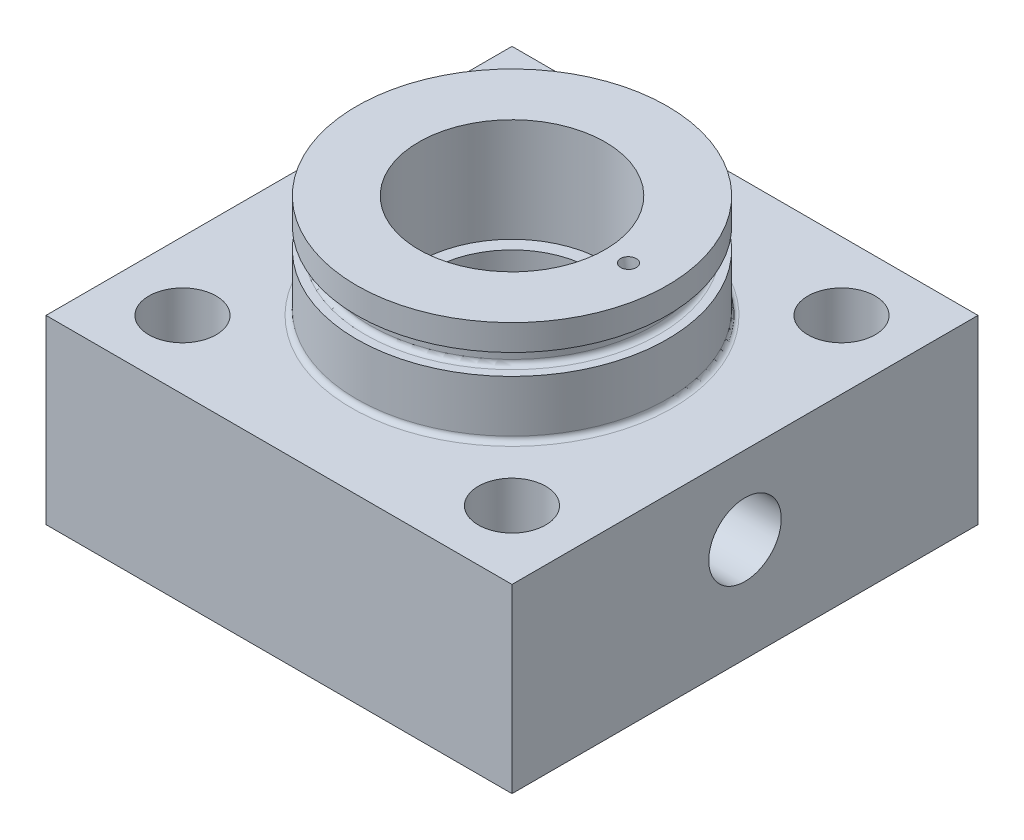
ISO-10303-21;
HEADER;
FILE_DESCRIPTION(('STEP AP214'),'2;1');
FILE_NAME('part.step','',(''),(''),'','','');
FILE_SCHEMA(('AUTOMOTIVE_DESIGN { 1 0 10303 214 1 1 1 1 }'));
ENDSEC;
DATA;
#1=APPLICATION_CONTEXT('core data for automotive mechanical design processes');
#2=APPLICATION_PROTOCOL_DEFINITION('international standard','automotive_design',2000,#1);
#3=PRODUCT_CONTEXT('',#1,'mechanical');
#4=PRODUCT('Part','Part','',(#3));
#5=PRODUCT_RELATED_PRODUCT_CATEGORY('part','',(#4));
#6=PRODUCT_DEFINITION_FORMATION('','',#4);
#7=PRODUCT_DEFINITION_CONTEXT('part definition',#1,'design');
#8=PRODUCT_DEFINITION('design','',#6,#7);
#9=PRODUCT_DEFINITION_SHAPE('','',#8);
#10=(LENGTH_UNIT() NAMED_UNIT(*) SI_UNIT(.MILLI.,.METRE.));
#11=(NAMED_UNIT(*) PLANE_ANGLE_UNIT() SI_UNIT($,.RADIAN.));
#12=(NAMED_UNIT(*) SI_UNIT($,.STERADIAN.) SOLID_ANGLE_UNIT());
#13=UNCERTAINTY_MEASURE_WITH_UNIT(LENGTH_MEASURE(1.E-05),#10,'distance_accuracy_value','');
#14=(GEOMETRIC_REPRESENTATION_CONTEXT(3) GLOBAL_UNCERTAINTY_ASSIGNED_CONTEXT((#13)) GLOBAL_UNIT_ASSIGNED_CONTEXT((#10,
#11,#12)) REPRESENTATION_CONTEXT('',''));
#15=CARTESIAN_POINT('',(0.,0.,0.));
#16=DIRECTION('',(0.,0.,1.));
#17=DIRECTION('',(1.,0.,0.));
#18=AXIS2_PLACEMENT_3D('',#15,#16,#17);
#19=CARTESIAN_POINT('',(0.,55.,0.));
#20=DIRECTION('',(0.,1.,0.));
#21=DIRECTION('',(0.,0.,1.));
#22=AXIS2_PLACEMENT_3D('',#19,#20,#21);
#23=PLANE('',#22);
#24=CARTESIAN_POINT('',(0.,55.,0.));
#25=DIRECTION('',(0.,-1.,0.));
#26=DIRECTION('',(0.,0.,-1.));
#27=AXIS2_PLACEMENT_3D('',#24,#25,#26);
#28=CIRCLE('',#27,18.);
#29=CARTESIAN_POINT('',(0.,55.,-18.));
#30=VERTEX_POINT('',#29);
#31=EDGE_CURVE('E150',#30,#30,#28,.T.);
#32=ORIENTED_EDGE('',*,*,#31,.T.);
#33=EDGE_LOOP('',(#32));
#34=FACE_BOUND('',#33,.T.);
#35=CARTESIAN_POINT('',(0.,55.,0.));
#36=DIRECTION('',(0.,1.,0.));
#37=DIRECTION('',(0.,0.,1.));
#38=AXIS2_PLACEMENT_3D('',#35,#36,#37);
#39=CIRCLE('',#38,30.);
#40=CARTESIAN_POINT('',(0.,55.,30.));
#41=VERTEX_POINT('',#40);
#42=EDGE_CURVE('E153',#41,#41,#39,.T.);
#43=ORIENTED_EDGE('',*,*,#42,.T.);
#44=EDGE_LOOP('',(#43));
#45=FACE_BOUND('',#44,.T.);
#46=CARTESIAN_POINT('',(22.5,55.,0.));
#47=DIRECTION('',(0.,1.,0.));
#48=DIRECTION('',(-1.,0.,0.));
#49=AXIS2_PLACEMENT_3D('',#46,#47,#48);
#50=ELLIPSE('',#49,1.52807504243282,1.5);
#51=CARTESIAN_POINT('',(20.9719249575672,55.,0.));
#52=VERTEX_POINT('',#51);
#53=EDGE_CURVE('E99',#52,#52,#50,.T.);
#54=ORIENTED_EDGE('',*,*,#53,.F.);
#55=EDGE_LOOP('',(#54));
#56=FACE_BOUND('',#55,.T.);
#57=ADVANCED_FACE('F38',(#34,#45,#56),#23,.T.);
#58=CARTESIAN_POINT('',(27.,20.,0.));
#59=DIRECTION('',(1.,0.,0.));
#60=DIRECTION('',(0.,0.,-1.));
#61=AXIS2_PLACEMENT_3D('',#58,#59,#60);
#62=CONICAL_SURFACE('',#61,7.,1.02974425867665);
#63=CARTESIAN_POINT('',(22.7939756668071,20.,0.));
#64=VERTEX_POINT('',#63);
#65=VERTEX_LOOP('',#64);
#66=FACE_BOUND('',#65,.T.);
#67=CARTESIAN_POINT('',(27.0002000000009,26.9025560211562,1.16592472662914));
#68=CARTESIAN_POINT('',(26.9557471986683,26.8351827867763,1.12020981943226));
#69=CARTESIAN_POINT('',(26.9123093250318,26.7703503300823,1.06886121542777));
#70=CARTESIAN_POINT('',(26.8293614449284,26.6480668091781,0.95421329721106));
#71=CARTESIAN_POINT('',(26.7898892242114,26.5906854615497,0.890813130714368));
#72=CARTESIAN_POINT('',(26.7254706650835,26.4981487202898,0.767215922519848));
#73=CARTESIAN_POINT('',(26.6992309276878,26.4608723352743,0.709309347198773));
#74=CARTESIAN_POINT('',(26.6523623589619,26.3948114018753,0.586945834746067));
#75=CARTESIAN_POINT('',(26.6317164053611,26.3660009164001,0.522509735648986));
#76=CARTESIAN_POINT('',(26.5972407465655,26.3181573434041,0.387626677030079));
#77=CARTESIAN_POINT('',(26.5834742116664,26.2992148034648,0.317130736717303));
#78=CARTESIAN_POINT('',(26.564275254162,26.2728568313713,0.172868456593609));
#79=CARTESIAN_POINT('',(26.5588418265405,26.2654400091542,0.0991025122664565));
#80=CARTESIAN_POINT('',(26.5569686559182,26.262880919729,-0.0390022692295941));
#81=CARTESIAN_POINT('',(26.5594400204153,26.2662525575678,-0.103304955583692));
#82=CARTESIAN_POINT('',(26.5708619743497,26.2818957014114,-0.230200999365168));
#83=CARTESIAN_POINT('',(26.5798106114341,26.2941645256649,-0.292794865959872));
#84=CARTESIAN_POINT('',(26.6032954196086,26.3265593320812,-0.413294823835385));
#85=CARTESIAN_POINT('',(26.6177082363583,26.3465119974908,-0.471272461180886));
#86=CARTESIAN_POINT('',(26.6512750360872,26.3933335161948,-0.5828808403607));
#87=CARTESIAN_POINT('',(26.6704313483764,26.4202057676356,-0.636509429352935));
#88=CARTESIAN_POINT('',(26.7205992737893,26.4911969769087,-0.758239344651641));
#89=CARTESIAN_POINT('',(26.7533467793441,26.5379858586705,-0.824067812989315));
#90=CARTESIAN_POINT('',(26.8239048094191,26.6401520509939,-0.945590901469656));
#91=CARTESIAN_POINT('',(26.8617236513894,26.6955434946542,-1.00126851159667));
#92=CARTESIAN_POINT('',(26.917210167002,26.7778888972262,-1.07260550826475));
#93=CARTESIAN_POINT('',(26.9335445389282,26.802252091771,-1.0924335836804));
#94=CARTESIAN_POINT('',(26.9665919876018,26.8517953974833,-1.13040006163989));
#95=CARTESIAN_POINT('',(26.9833030318249,26.8769713439381,-1.14854565923984));
#96=CARTESIAN_POINT('',(27.0002000000005,26.9025560211554,-1.1659247266304));
#97=B_SPLINE_CURVE_WITH_KNOTS('',3,(#67,#68,#69,#70,#71,#72,#73,#74,#75,#76,#77,#78,#79,#80,#81,
#82,#83,#84,#85,#86,#87,#88,#89,#90,#91,#92,#93,#94,#95,#96),.UNSPECIFIED.,.F.,.F.,(4,2,2,2,2,2,
2,2,2,2,2,2,2,2,4),(0.,0.278795202966231,0.560035286614454,0.780245184551265,0.99977321487787,
1.22128163148936,1.44276333093355,1.63511494120735,1.82740859777992,2.01559738073721,
2.20387875835251,2.46391097070981,2.72437499806625,2.83055287480321,2.93625343960105),.UNSPECIFIED.);
#98=CARTESIAN_POINT('',(27.,26.9022531981226,1.16571900087752));
#99=VERTEX_POINT('',#98);
#100=CARTESIAN_POINT('',(27.,26.9022531981226,-1.16571900087752));
#101=VERTEX_POINT('',#100);
#102=EDGE_CURVE('E57',#99,#101,#97,.T.);
#103=ORIENTED_EDGE('',*,*,#102,.F.);
#104=CARTESIAN_POINT('',(27.,20.,0.));
#105=DIRECTION('',(1.,0.,0.));
#106=DIRECTION('',(0.,0.,-1.));
#107=AXIS2_PLACEMENT_3D('',#104,#105,#106);
#108=CIRCLE('',#107,7.);
#109=EDGE_CURVE('E97',#99,#101,#108,.T.);
#110=ORIENTED_EDGE('',*,*,#109,.T.);
#111=EDGE_LOOP('',(#103,#110));
#112=FACE_BOUND('',#111,.T.);
#113=ADVANCED_FACE('F96',(#66,#112),#62,.F.);
#114=CARTESIAN_POINT('',(45.,20.,0.));
#115=DIRECTION('',(1.,0.,0.));
#116=DIRECTION('',(0.,0.,-1.));
#117=AXIS2_PLACEMENT_3D('',#114,#115,#116);
#118=CYLINDRICAL_SURFACE('',#117,6.99999999999999);
#119=CARTESIAN_POINT('',(45.,20.,0.));
#120=DIRECTION('',(1.,0.,0.));
#121=DIRECTION('',(0.,0.,-1.));
#122=AXIS2_PLACEMENT_3D('',#119,#120,#121);
#123=CIRCLE('',#122,6.99999999999999);
#124=CARTESIAN_POINT('',(45.,20.,-6.99999999999998));
#125=VERTEX_POINT('',#124);
#126=EDGE_CURVE('E98',#125,#125,#123,.T.);
#127=ORIENTED_EDGE('',*,*,#126,.T.);
#128=EDGE_LOOP('',(#127));
#129=FACE_BOUND('',#128,.T.);
#130=CARTESIAN_POINT('',(27.,26.9022531981226,-1.16571900087752));
#131=CARTESIAN_POINT('',(27.0703399257818,26.8930190998978,-1.22025468295606));
#132=CARTESIAN_POINT('',(27.1453503336944,26.8841736608435,-1.26881501498369));
#133=CARTESIAN_POINT('',(27.3025893545098,26.8681487627433,-1.35294548860597));
#134=CARTESIAN_POINT('',(27.3848248078652,26.8609709064573,-1.38850315165746));
#135=CARTESIAN_POINT('',(27.5543198117525,26.8491859619893,-1.44550436690424));
#136=CARTESIAN_POINT('',(27.6415835571262,26.8445810555661,-1.46693594349939));
#137=CARTESIAN_POINT('',(27.8185402212261,26.8385586985497,-1.49476735894631));
#138=CARTESIAN_POINT('',(27.9082312942767,26.8371388913859,-1.50117831131656));
#139=CARTESIAN_POINT('',(28.0852526229535,26.837726588571,-1.49849737617922));
#140=CARTESIAN_POINT('',(28.1725884184588,26.8396536046781,-1.489769569409));
#141=CARTESIAN_POINT('',(28.344359048974,26.8466096902637,-1.45746592311796));
#142=CARTESIAN_POINT('',(28.4287939494422,26.8516386896977,-1.43389041886605));
#143=CARTESIAN_POINT('',(28.588859335821,26.8639672225966,-1.37362748579696));
#144=CARTESIAN_POINT('',(28.6647053688172,26.8711698275247,-1.33749137091391));
#145=CARTESIAN_POINT('',(28.8090399581684,26.887085240569,-1.25295598387026));
#146=CARTESIAN_POINT('',(28.8775293623143,26.8957978743638,-1.20455812693838));
#147=CARTESIAN_POINT('',(29.0045557975033,26.9136475120347,-1.09744505516076));
#148=CARTESIAN_POINT('',(29.0631913473845,26.9227789870094,-1.03884560297038));
#149=CARTESIAN_POINT('',(29.1698670366684,26.9405459238536,-0.912621132242576));
#150=CARTESIAN_POINT('',(29.2179065958447,26.9491813585414,-0.844995619771942));
#151=CARTESIAN_POINT('',(29.3025468718788,26.9650870829628,-0.701980139445608));
#152=CARTESIAN_POINT('',(29.3390446665384,26.9723448709412,-0.62652786386578));
#153=CARTESIAN_POINT('',(29.3991188338988,26.9846100583683,-0.470472182612644));
#154=CARTESIAN_POINT('',(29.4226949233999,26.9896174084947,-0.389868664084903));
#155=CARTESIAN_POINT('',(29.4564387267677,26.9968607077887,-0.225298045526707));
#156=CARTESIAN_POINT('',(29.4665289838591,26.999080642883,-0.141314344903382));
#157=CARTESIAN_POINT('',(29.4727968846034,27.0004542395642,0.0271956560167797));
#158=CARTESIAN_POINT('',(29.4689744339871,26.9996078803748,0.111721959986292));
#159=CARTESIAN_POINT('',(29.4475116055433,26.9949408829833,0.278924824638343));
#160=CARTESIAN_POINT('',(29.429870074133,26.9911199964753,0.361601230303261));
#161=CARTESIAN_POINT('',(29.3812078031611,26.9809205213274,0.52275377174951));
#162=CARTESIAN_POINT('',(29.3501868160755,26.9745418853687,0.601229829792959));
#163=CARTESIAN_POINT('',(29.2755340980976,26.9599255102752,0.751773645133417));
#164=CARTESIAN_POINT('',(29.2318991569969,26.9516872980016,0.823839765010035));
#165=CARTESIAN_POINT('',(29.1331353689054,26.934267992921,0.959484563681352));
#166=CARTESIAN_POINT('',(29.0780067789313,26.9250869212,1.02306343221279));
#167=CARTESIAN_POINT('',(28.9579251685022,26.9068494134804,1.13969804673486));
#168=CARTESIAN_POINT('',(28.8930077479804,26.8977926505639,1.1927903766027));
#169=CARTESIAN_POINT('',(28.7549924346718,26.8807987637808,1.28721338282879));
#170=CARTESIAN_POINT('',(28.6818953363111,26.8728615313523,1.32854520001184));
#171=CARTESIAN_POINT('',(28.5303433110149,26.8590732346296,1.39798511577011));
#172=CARTESIAN_POINT('',(28.4519462639682,26.8532029581542,1.42621581594965));
#173=CARTESIAN_POINT('',(28.2914398338856,26.8440791641152,1.46937781803568));
#174=CARTESIAN_POINT('',(28.2093307116833,26.8408254629957,1.4843100528541));
#175=CARTESIAN_POINT('',(28.0435284973748,26.8372456521932,1.50071433111481));
#176=CARTESIAN_POINT('',(27.9598320575912,26.8369266347656,1.50215376664338));
#177=CARTESIAN_POINT('',(27.7932881708397,26.8392091285329,1.49172508560607));
#178=CARTESIAN_POINT('',(27.7104411534262,26.8418120503089,1.47985054165115));
#179=CARTESIAN_POINT('',(27.5451280714467,26.8497306643927,1.44276102290741));
#180=CARTESIAN_POINT('',(27.4627604316339,26.855131124322,1.41712822891844));
#181=CARTESIAN_POINT('',(27.3033832793302,26.8680517011054,1.35311601803852));
#182=CARTESIAN_POINT('',(27.2263676066027,26.8755693289251,1.31475155965436));
#183=CARTESIAN_POINT('',(27.1265052298055,26.8866760376606,1.25457375346957));
#184=CARTESIAN_POINT('',(27.1004490846446,26.8897113215701,1.23781799035897));
#185=CARTESIAN_POINT('',(27.0494143227519,26.8959017196965,1.20285263049424));
#186=CARTESIAN_POINT('',(27.0244338848618,26.8990566128922,1.18464565270883));
#187=CARTESIAN_POINT('',(27.,26.9022531981226,1.16571900087752));
#188=B_SPLINE_CURVE_WITH_KNOTS('',3,(#130,#131,#132,#133,#134,#135,#136,#137,#138,#139,#140,
#141,#142,#143,#144,#145,#146,#147,#148,#149,#150,#151,#152,#153,#154,#155,#156,#157,#158,#159,
#160,#161,#162,#163,#164,#165,#166,#167,#168,#169,#170,#171,#172,#173,#174,#175,#176,#177,#178,
#179,#180,#181,#182,#183,#184,#185,#186,#187),.UNSPECIFIED.,.F.,.F.,(4,2,2,2,2,2,2,2,2,2,2,2,2,
2,2,2,2,2,2,2,2,2,2,2,2,2,2,2,4),(0.,0.268127180453118,0.536511008971517,0.805122072229803,
1.07353433163254,1.33558055117146,1.5976208537795,1.8493699214137,2.10108994583936,
2.35012042739379,2.59916454223781,2.85037063660583,3.10158223633364,3.35423057347462,
3.60688062250259,3.85955176438251,4.11222758095465,4.36496775935842,4.61770228668273,
4.86953890267855,5.12135108100841,5.37075673857607,5.62014489849715,5.8701355973709,
6.12024703246488,6.37842337933574,6.63629746092069,6.72963856216666,6.82281486983012),.UNSPECIFIED.);
#189=EDGE_CURVE('E11',#101,#99,#188,.T.);
#190=ORIENTED_EDGE('',*,*,#189,.F.);
#191=ORIENTED_EDGE('',*,*,#109,.F.);
#192=EDGE_LOOP('',(#190,#191));
#193=FACE_BOUND('',#192,.T.);
#194=ADVANCED_FACE('F101',(#129,#193),#118,.F.);
#195=CARTESIAN_POINT('',(-45.,0.,-45.));
#196=DIRECTION('',(0.,-1.,0.));
#197=DIRECTION('',(0.,0.,-1.));
#198=AXIS2_PLACEMENT_3D('',#195,#196,#197);
#199=PLANE('',#198);
#200=CARTESIAN_POINT('',(-31.8198051533946,0.,31.8198051533946));
#201=DIRECTION('',(0.,-1.,0.));
#202=DIRECTION('',(0.,0.,1.));
#203=AXIS2_PLACEMENT_3D('',#200,#201,#202);
#204=CIRCLE('',#203,6.5);
#205=CARTESIAN_POINT('',(-31.8198051533946,0.,38.3198051533946));
#206=VERTEX_POINT('',#205);
#207=EDGE_CURVE('E102',#206,#206,#204,.T.);
#208=ORIENTED_EDGE('',*,*,#207,.F.);
#209=EDGE_LOOP('',(#208));
#210=FACE_BOUND('',#209,.T.);
#211=CARTESIAN_POINT('',(31.8198051533946,0.,31.8198051533946));
#212=DIRECTION('',(0.,1.,0.));
#213=DIRECTION('',(0.,0.,1.));
#214=AXIS2_PLACEMENT_3D('',#211,#212,#213);
#215=CIRCLE('',#214,6.5);
#216=CARTESIAN_POINT('',(31.8198051533946,0.,38.3198051533946));
#217=VERTEX_POINT('',#216);
#218=EDGE_CURVE('E114',#217,#217,#215,.T.);
#219=ORIENTED_EDGE('',*,*,#218,.T.);
#220=EDGE_LOOP('',(#219));
#221=FACE_BOUND('',#220,.T.);
#222=CARTESIAN_POINT('',(31.8198051533946,0.,-31.8198051533946));
#223=DIRECTION('',(0.,-1.,0.));
#224=DIRECTION('',(0.,0.,-1.));
#225=AXIS2_PLACEMENT_3D('',#222,#223,#224);
#226=CIRCLE('',#225,6.5);
#227=CARTESIAN_POINT('',(31.8198051533946,0.,-38.3198051533946));
#228=VERTEX_POINT('',#227);
#229=EDGE_CURVE('E118',#228,#228,#226,.T.);
#230=ORIENTED_EDGE('',*,*,#229,.F.);
#231=EDGE_LOOP('',(#230));
#232=FACE_BOUND('',#231,.T.);
#233=DIRECTION('',(0.,0.,1.));
#234=VECTOR('',#233,1.);
#235=CARTESIAN_POINT('',(-45.,0.,45.));
#236=LINE('',#235,#234);
#237=CARTESIAN_POINT('',(-45.,0.,-45.));
#238=VERTEX_POINT('',#237);
#239=CARTESIAN_POINT('',(-45.,0.,45.));
#240=VERTEX_POINT('',#239);
#241=EDGE_CURVE('E156',#238,#240,#236,.T.);
#242=ORIENTED_EDGE('',*,*,#241,.F.);
#243=DIRECTION('',(-1.,0.,0.));
#244=VECTOR('',#243,1.);
#245=CARTESIAN_POINT('',(-45.,0.,-45.));
#246=LINE('',#245,#244);
#247=CARTESIAN_POINT('',(45.,0.,-45.));
#248=VERTEX_POINT('',#247);
#249=EDGE_CURVE('E163',#248,#238,#246,.T.);
#250=ORIENTED_EDGE('',*,*,#249,.F.);
#251=DIRECTION('',(0.,0.,-1.));
#252=VECTOR('',#251,1.);
#253=CARTESIAN_POINT('',(45.,0.,45.));
#254=LINE('',#253,#252);
#255=CARTESIAN_POINT('',(45.,0.,45.));
#256=VERTEX_POINT('',#255);
#257=EDGE_CURVE('E161',#256,#248,#254,.T.);
#258=ORIENTED_EDGE('',*,*,#257,.F.);
#259=DIRECTION('',(1.,0.,0.));
#260=VECTOR('',#259,1.);
#261=CARTESIAN_POINT('',(-45.,0.,45.));
#262=LINE('',#261,#260);
#263=EDGE_CURVE('E159',#240,#256,#262,.T.);
#264=ORIENTED_EDGE('',*,*,#263,.F.);
#265=EDGE_LOOP('',(#242,#250,#258,#264));
#266=FACE_BOUND('',#265,.T.);
#267=CARTESIAN_POINT('',(0.,0.,0.));
#268=DIRECTION('',(0.,-1.,0.));
#269=DIRECTION('',(0.,0.,-1.));
#270=AXIS2_PLACEMENT_3D('',#267,#268,#269);
#271=CIRCLE('',#270,23.);
#272=CARTESIAN_POINT('',(0.,0.,-23.));
#273=VERTEX_POINT('',#272);
#274=EDGE_CURVE('E122',#273,#273,#271,.T.);
#275=ORIENTED_EDGE('',*,*,#274,.F.);
#276=EDGE_LOOP('',(#275));
#277=FACE_BOUND('',#276,.T.);
#278=CARTESIAN_POINT('',(-31.8198051533946,0.,-31.8198051533946));
#279=DIRECTION('',(0.,1.,0.));
#280=DIRECTION('',(0.,0.,-1.));
#281=AXIS2_PLACEMENT_3D('',#278,#279,#280);
#282=CIRCLE('',#281,6.5);
#283=CARTESIAN_POINT('',(-31.8198051533946,0.,-38.3198051533946));
#284=VERTEX_POINT('',#283);
#285=EDGE_CURVE('E110',#284,#284,#282,.T.);
#286=ORIENTED_EDGE('',*,*,#285,.T.);
#287=EDGE_LOOP('',(#286));
#288=FACE_BOUND('',#287,.T.);
#289=ADVANCED_FACE('F250',(#210,#221,#232,#266,#277,#288),#199,.T.);
#290=CARTESIAN_POINT('',(-45.,35.,-45.));
#291=DIRECTION('',(0.,-1.,0.));
#292=DIRECTION('',(0.,0.,-1.));
#293=AXIS2_PLACEMENT_3D('',#290,#291,#292);
#294=PLANE('',#293);
#295=CARTESIAN_POINT('',(0.,35.,0.));
#296=DIRECTION('',(0.,-1.,0.));
#297=DIRECTION('',(0.,0.,-1.));
#298=AXIS2_PLACEMENT_3D('',#295,#296,#297);
#299=CIRCLE('',#298,31.);
#300=CARTESIAN_POINT('',(0.,35.,-31.));
#301=VERTEX_POINT('',#300);
#302=EDGE_CURVE('E200',#301,#301,#299,.T.);
#303=ORIENTED_EDGE('',*,*,#302,.T.);
#304=EDGE_LOOP('',(#303));
#305=FACE_BOUND('',#304,.T.);
#306=CARTESIAN_POINT('',(-31.8198051533946,35.,31.8198051533946));
#307=DIRECTION('',(0.,-1.,0.));
#308=DIRECTION('',(0.,0.,-1.));
#309=AXIS2_PLACEMENT_3D('',#306,#307,#308);
#310=CIRCLE('',#309,6.5);
#311=CARTESIAN_POINT('',(-31.8198051533946,35.,25.3198051533946));
#312=VERTEX_POINT('',#311);
#313=EDGE_CURVE('E105',#312,#312,#310,.T.);
#314=ORIENTED_EDGE('',*,*,#313,.T.);
#315=EDGE_LOOP('',(#314));
#316=FACE_BOUND('',#315,.T.);
#317=CARTESIAN_POINT('',(31.8198051533946,35.,31.8198051533946));
#318=DIRECTION('',(0.,-1.,0.));
#319=DIRECTION('',(0.,0.,-1.));
#320=AXIS2_PLACEMENT_3D('',#317,#318,#319);
#321=CIRCLE('',#320,6.5);
#322=CARTESIAN_POINT('',(31.8198051533946,35.,25.3198051533946));
#323=VERTEX_POINT('',#322);
#324=EDGE_CURVE('E117',#323,#323,#321,.F.);
#325=ORIENTED_EDGE('',*,*,#324,.F.);
#326=EDGE_LOOP('',(#325));
#327=FACE_BOUND('',#326,.T.);
#328=CARTESIAN_POINT('',(31.8198051533946,35.,-31.8198051533946));
#329=DIRECTION('',(0.,-1.,0.));
#330=DIRECTION('',(0.,0.,-1.));
#331=AXIS2_PLACEMENT_3D('',#328,#329,#330);
#332=CIRCLE('',#331,6.5);
#333=CARTESIAN_POINT('',(31.8198051533946,35.,-38.3198051533946));
#334=VERTEX_POINT('',#333);
#335=EDGE_CURVE('E121',#334,#334,#332,.T.);
#336=ORIENTED_EDGE('',*,*,#335,.T.);
#337=EDGE_LOOP('',(#336));
#338=FACE_BOUND('',#337,.T.);
#339=DIRECTION('',(0.,0.,1.));
#340=VECTOR('',#339,1.);
#341=CARTESIAN_POINT('',(-45.,35.,45.));
#342=LINE('',#341,#340);
#343=CARTESIAN_POINT('',(-45.,35.,-45.));
#344=VERTEX_POINT('',#343);
#345=CARTESIAN_POINT('',(-45.,35.,45.));
#346=VERTEX_POINT('',#345);
#347=EDGE_CURVE('E165',#344,#346,#342,.T.);
#348=ORIENTED_EDGE('',*,*,#347,.T.);
#349=DIRECTION('',(1.,0.,0.));
#350=VECTOR('',#349,1.);
#351=CARTESIAN_POINT('',(-45.,35.,45.));
#352=LINE('',#351,#350);
#353=CARTESIAN_POINT('',(45.,35.,45.));
#354=VERTEX_POINT('',#353);
#355=EDGE_CURVE('E167',#346,#354,#352,.T.);
#356=ORIENTED_EDGE('',*,*,#355,.T.);
#357=DIRECTION('',(0.,0.,-1.));
#358=VECTOR('',#357,1.);
#359=CARTESIAN_POINT('',(45.,35.,45.));
#360=LINE('',#359,#358);
#361=CARTESIAN_POINT('',(45.,35.,-45.));
#362=VERTEX_POINT('',#361);
#363=EDGE_CURVE('E169',#354,#362,#360,.T.);
#364=ORIENTED_EDGE('',*,*,#363,.T.);
#365=DIRECTION('',(-1.,0.,0.));
#366=VECTOR('',#365,1.);
#367=CARTESIAN_POINT('',(-45.,35.,-45.));
#368=LINE('',#367,#366);
#369=EDGE_CURVE('E65',#362,#344,#368,.T.);
#370=ORIENTED_EDGE('',*,*,#369,.T.);
#371=EDGE_LOOP('',(#348,#356,#364,#370));
#372=FACE_BOUND('',#371,.T.);
#373=CARTESIAN_POINT('',(-31.8198051533946,35.,-31.8198051533946));
#374=DIRECTION('',(0.,-1.,0.));
#375=DIRECTION('',(0.,0.,-1.));
#376=AXIS2_PLACEMENT_3D('',#373,#374,#375);
#377=CIRCLE('',#376,6.5);
#378=CARTESIAN_POINT('',(-31.8198051533946,35.,-38.3198051533946));
#379=VERTEX_POINT('',#378);
#380=EDGE_CURVE('E113',#379,#379,#377,.F.);
#381=ORIENTED_EDGE('',*,*,#380,.F.);
#382=EDGE_LOOP('',(#381));
#383=FACE_BOUND('',#382,.T.);
#384=ADVANCED_FACE('F248',(#305,#316,#327,#338,#372,#383),#294,.F.);
#385=CARTESIAN_POINT('',(0.,55.,0.));
#386=DIRECTION('',(0.,-1.,0.));
#387=DIRECTION('',(0.,0.,-1.));
#388=AXIS2_PLACEMENT_3D('',#385,#386,#387);
#389=CYLINDRICAL_SURFACE('',#388,30.);
#390=CARTESIAN_POINT('',(0.,36.,0.));
#391=DIRECTION('',(0.,-1.,0.));
#392=DIRECTION('',(0.,0.,-1.));
#393=AXIS2_PLACEMENT_3D('',#390,#391,#392);
#394=CIRCLE('',#393,30.);
#395=CARTESIAN_POINT('',(0.,36.,-30.));
#396=VERTEX_POINT('',#395);
#397=EDGE_CURVE('E184',#396,#396,#394,.F.);
#398=ORIENTED_EDGE('',*,*,#397,.T.);
#399=EDGE_LOOP('',(#398));
#400=FACE_BOUND('',#399,.T.);
#401=CARTESIAN_POINT('',(0.,46.,0.));
#402=DIRECTION('',(0.,1.,0.));
#403=DIRECTION('',(0.,0.,1.));
#404=AXIS2_PLACEMENT_3D('',#401,#402,#403);
#405=CIRCLE('',#404,30.);
#406=CARTESIAN_POINT('',(0.,46.,30.));
#407=VERTEX_POINT('',#406);
#408=EDGE_CURVE('E126',#407,#407,#405,.T.);
#409=ORIENTED_EDGE('',*,*,#408,.F.);
#410=EDGE_LOOP('',(#409));
#411=FACE_BOUND('',#410,.T.);
#412=ADVANCED_FACE('F244',(#400,#411),#389,.T.);
#413=ORIENTED_EDGE('',*,*,#42,.F.);
#414=EDGE_LOOP('',(#413));
#415=FACE_BOUND('',#414,.T.);
#416=CARTESIAN_POINT('',(0.,50.,0.));
#417=DIRECTION('',(0.,-1.,0.));
#418=DIRECTION('',(0.,0.,-1.));
#419=AXIS2_PLACEMENT_3D('',#416,#417,#418);
#420=CIRCLE('',#419,30.);
#421=CARTESIAN_POINT('',(0.,50.,-30.));
#422=VERTEX_POINT('',#421);
#423=EDGE_CURVE('E185',#422,#422,#420,.T.);
#424=ORIENTED_EDGE('',*,*,#423,.F.);
#425=EDGE_LOOP('',(#424));
#426=FACE_BOUND('',#425,.T.);
#427=ADVANCED_FACE('F247',(#415,#426),#389,.T.);
#428=CARTESIAN_POINT('',(-45.,35.,45.));
#429=DIRECTION('',(1.,0.,0.));
#430=DIRECTION('',(0.,0.,-1.));
#431=AXIS2_PLACEMENT_3D('',#428,#429,#430);
#432=PLANE('',#431);
#433=ORIENTED_EDGE('',*,*,#241,.T.);
#434=DIRECTION('',(0.,-1.,0.));
#435=VECTOR('',#434,1.);
#436=CARTESIAN_POINT('',(-45.,35.,45.));
#437=LINE('',#436,#435);
#438=EDGE_CURVE('E181',#346,#240,#437,.T.);
#439=ORIENTED_EDGE('',*,*,#438,.F.);
#440=ORIENTED_EDGE('',*,*,#347,.F.);
#441=DIRECTION('',(0.,-1.,0.));
#442=VECTOR('',#441,1.);
#443=CARTESIAN_POINT('',(-45.,35.,-45.));
#444=LINE('',#443,#442);
#445=EDGE_CURVE('E172',#344,#238,#444,.T.);
#446=ORIENTED_EDGE('',*,*,#445,.T.);
#447=EDGE_LOOP('',(#433,#439,#440,#446));
#448=FACE_BOUND('',#447,.T.);
#449=ADVANCED_FACE('F40',(#448),#432,.F.);
#450=CARTESIAN_POINT('',(-45.,35.,45.));
#451=DIRECTION('',(0.,0.,-1.));
#452=DIRECTION('',(-1.,0.,0.));
#453=AXIS2_PLACEMENT_3D('',#450,#451,#452);
#454=PLANE('',#453);
#455=ORIENTED_EDGE('',*,*,#263,.T.);
#456=DIRECTION('',(0.,-1.,0.));
#457=VECTOR('',#456,1.);
#458=CARTESIAN_POINT('',(45.,35.,45.));
#459=LINE('',#458,#457);
#460=EDGE_CURVE('E178',#354,#256,#459,.T.);
#461=ORIENTED_EDGE('',*,*,#460,.F.);
#462=ORIENTED_EDGE('',*,*,#355,.F.);
#463=ORIENTED_EDGE('',*,*,#438,.T.);
#464=EDGE_LOOP('',(#455,#461,#462,#463));
#465=FACE_BOUND('',#464,.T.);
#466=ADVANCED_FACE('F263',(#465),#454,.F.);
#467=CARTESIAN_POINT('',(45.,35.,45.));
#468=DIRECTION('',(-1.,0.,0.));
#469=DIRECTION('',(0.,0.,1.));
#470=AXIS2_PLACEMENT_3D('',#467,#468,#469);
#471=PLANE('',#470);
#472=ORIENTED_EDGE('',*,*,#126,.F.);
#473=EDGE_LOOP('',(#472));
#474=FACE_BOUND('',#473,.T.);
#475=ORIENTED_EDGE('',*,*,#257,.T.);
#476=DIRECTION('',(0.,-1.,0.));
#477=VECTOR('',#476,1.);
#478=CARTESIAN_POINT('',(45.,35.,-45.));
#479=LINE('',#478,#477);
#480=EDGE_CURVE('E175',#362,#248,#479,.T.);
#481=ORIENTED_EDGE('',*,*,#480,.F.);
#482=ORIENTED_EDGE('',*,*,#363,.F.);
#483=ORIENTED_EDGE('',*,*,#460,.T.);
#484=EDGE_LOOP('',(#475,#481,#482,#483));
#485=FACE_BOUND('',#484,.T.);
#486=ADVANCED_FACE('F260',(#474,#485),#471,.F.);
#487=CARTESIAN_POINT('',(-45.,35.,-45.));
#488=DIRECTION('',(0.,0.,1.));
#489=DIRECTION('',(1.,0.,0.));
#490=AXIS2_PLACEMENT_3D('',#487,#488,#489);
#491=PLANE('',#490);
#492=ORIENTED_EDGE('',*,*,#249,.T.);
#493=ORIENTED_EDGE('',*,*,#445,.F.);
#494=ORIENTED_EDGE('',*,*,#369,.F.);
#495=ORIENTED_EDGE('',*,*,#480,.T.);
#496=EDGE_LOOP('',(#492,#493,#494,#495));
#497=FACE_BOUND('',#496,.T.);
#498=ADVANCED_FACE('F257',(#497),#491,.F.);
#499=CARTESIAN_POINT('',(0.,0.,0.));
#500=DIRECTION('',(0.,-1.,0.));
#501=DIRECTION('',(0.,0.,-1.));
#502=AXIS2_PLACEMENT_3D('',#499,#500,#501);
#503=CYLINDRICAL_SURFACE('',#502,18.);
#504=CARTESIAN_POINT('',(0.,35.,0.));
#505=DIRECTION('',(0.,-1.,0.));
#506=DIRECTION('',(0.,0.,-1.));
#507=AXIS2_PLACEMENT_3D('',#504,#505,#506);
#508=CIRCLE('',#507,18.);
#509=CARTESIAN_POINT('',(0.,35.,-18.));
#510=VERTEX_POINT('',#509);
#511=EDGE_CURVE('E147',#510,#510,#508,.T.);
#512=ORIENTED_EDGE('',*,*,#511,.T.);
#513=EDGE_LOOP('',(#512));
#514=FACE_BOUND('',#513,.T.);
#515=ORIENTED_EDGE('',*,*,#31,.F.);
#516=EDGE_LOOP('',(#515));
#517=FACE_BOUND('',#516,.T.);
#518=ADVANCED_FACE('F242',(#514,#517),#503,.F.);
#519=CARTESIAN_POINT('',(-15.5,35.,0.));
#520=DIRECTION('',(0.,1.,0.));
#521=DIRECTION('',(0.,0.,1.));
#522=AXIS2_PLACEMENT_3D('',#519,#520,#521);
#523=PLANE('',#522);
#524=CARTESIAN_POINT('',(0.,35.,0.));
#525=DIRECTION('',(0.,-1.,0.));
#526=DIRECTION('',(0.,0.,-1.));
#527=AXIS2_PLACEMENT_3D('',#524,#525,#526);
#528=CIRCLE('',#527,15.5);
#529=CARTESIAN_POINT('',(0.,35.,-15.5));
#530=VERTEX_POINT('',#529);
#531=EDGE_CURVE('E144',#530,#530,#528,.T.);
#532=ORIENTED_EDGE('',*,*,#531,.T.);
#533=EDGE_LOOP('',(#532));
#534=FACE_BOUND('',#533,.T.);
#535=ORIENTED_EDGE('',*,*,#511,.F.);
#536=EDGE_LOOP('',(#535));
#537=FACE_BOUND('',#536,.T.);
#538=ADVANCED_FACE('F341',(#534,#537),#523,.T.);
#539=CARTESIAN_POINT('',(0.,0.,0.));
#540=DIRECTION('',(0.,-1.,0.));
#541=DIRECTION('',(0.,0.,-1.));
#542=AXIS2_PLACEMENT_3D('',#539,#540,#541);
#543=CYLINDRICAL_SURFACE('',#542,15.5);
#544=CARTESIAN_POINT('',(0.,26.,0.));
#545=DIRECTION('',(0.,-1.,0.));
#546=DIRECTION('',(0.,0.,-1.));
#547=AXIS2_PLACEMENT_3D('',#544,#545,#546);
#548=CIRCLE('',#547,15.5);
#549=CARTESIAN_POINT('',(0.,26.,-15.5));
#550=VERTEX_POINT('',#549);
#551=EDGE_CURVE('E141',#550,#550,#548,.T.);
#552=ORIENTED_EDGE('',*,*,#551,.T.);
#553=EDGE_LOOP('',(#552));
#554=FACE_BOUND('',#553,.T.);
#555=ORIENTED_EDGE('',*,*,#531,.F.);
#556=EDGE_LOOP('',(#555));
#557=FACE_BOUND('',#556,.T.);
#558=ADVANCED_FACE('F338',(#554,#557),#543,.F.);
#559=CARTESIAN_POINT('',(-21.,26.,0.));
#560=DIRECTION('',(0.,-1.,0.));
#561=DIRECTION('',(0.,0.,-1.));
#562=AXIS2_PLACEMENT_3D('',#559,#560,#561);
#563=PLANE('',#562);
#564=CARTESIAN_POINT('',(0.,26.,0.));
#565=DIRECTION('',(0.,-1.,0.));
#566=DIRECTION('',(0.,0.,-1.));
#567=AXIS2_PLACEMENT_3D('',#564,#565,#566);
#568=CIRCLE('',#567,21.);
#569=CARTESIAN_POINT('',(0.,26.,-21.));
#570=VERTEX_POINT('',#569);
#571=EDGE_CURVE('E138',#570,#570,#568,.T.);
#572=ORIENTED_EDGE('',*,*,#571,.T.);
#573=EDGE_LOOP('',(#572));
#574=FACE_BOUND('',#573,.T.);
#575=ORIENTED_EDGE('',*,*,#551,.F.);
#576=EDGE_LOOP('',(#575));
#577=FACE_BOUND('',#576,.T.);
#578=ADVANCED_FACE('F334',(#574,#577),#563,.T.);
#579=CARTESIAN_POINT('',(0.,0.,0.));
#580=DIRECTION('',(0.,-1.,0.));
#581=DIRECTION('',(0.,0.,-1.));
#582=AXIS2_PLACEMENT_3D('',#579,#580,#581);
#583=CYLINDRICAL_SURFACE('',#582,21.);
#584=CARTESIAN_POINT('',(0.,12.,0.));
#585=DIRECTION('',(0.,-1.,0.));
#586=DIRECTION('',(0.,0.,-1.));
#587=AXIS2_PLACEMENT_3D('',#584,#585,#586);
#588=CIRCLE('',#587,21.);
#589=CARTESIAN_POINT('',(0.,12.,-21.));
#590=VERTEX_POINT('',#589);
#591=EDGE_CURVE('E135',#590,#590,#588,.T.);
#592=ORIENTED_EDGE('',*,*,#591,.T.);
#593=EDGE_LOOP('',(#592));
#594=FACE_BOUND('',#593,.T.);
#595=ORIENTED_EDGE('',*,*,#571,.F.);
#596=EDGE_LOOP('',(#595));
#597=FACE_BOUND('',#596,.T.);
#598=ADVANCED_FACE('F330',(#594,#597),#583,.F.);
#599=CARTESIAN_POINT('',(-24.25,12.,0.));
#600=DIRECTION('',(0.,-1.,0.));
#601=DIRECTION('',(0.,0.,-1.));
#602=AXIS2_PLACEMENT_3D('',#599,#600,#601);
#603=PLANE('',#602);
#604=CARTESIAN_POINT('',(0.,12.,0.));
#605=DIRECTION('',(0.,-1.,0.));
#606=DIRECTION('',(0.,0.,-1.));
#607=AXIS2_PLACEMENT_3D('',#604,#605,#606);
#608=CIRCLE('',#607,24.25);
#609=CARTESIAN_POINT('',(0.,12.,-24.25));
#610=VERTEX_POINT('',#609);
#611=EDGE_CURVE('E132',#610,#610,#608,.T.);
#612=ORIENTED_EDGE('',*,*,#611,.T.);
#613=EDGE_LOOP('',(#612));
#614=FACE_BOUND('',#613,.T.);
#615=ORIENTED_EDGE('',*,*,#591,.F.);
#616=EDGE_LOOP('',(#615));
#617=FACE_BOUND('',#616,.T.);
#618=ADVANCED_FACE('F326',(#614,#617),#603,.T.);
#619=CARTESIAN_POINT('',(0.,0.,0.));
#620=DIRECTION('',(0.,-1.,0.));
#621=DIRECTION('',(0.,0.,-1.));
#622=AXIS2_PLACEMENT_3D('',#619,#620,#621);
#623=CYLINDRICAL_SURFACE('',#622,24.25);
#624=CARTESIAN_POINT('',(0.,8.99999999999999,0.));
#625=DIRECTION('',(0.,-1.,0.));
#626=DIRECTION('',(0.,0.,-1.));
#627=AXIS2_PLACEMENT_3D('',#624,#625,#626);
#628=CIRCLE('',#627,24.25);
#629=CARTESIAN_POINT('',(0.,8.99999999999999,-24.25));
#630=VERTEX_POINT('',#629);
#631=EDGE_CURVE('E129',#630,#630,#628,.T.);
#632=ORIENTED_EDGE('',*,*,#631,.T.);
#633=EDGE_LOOP('',(#632));
#634=FACE_BOUND('',#633,.T.);
#635=ORIENTED_EDGE('',*,*,#611,.F.);
#636=EDGE_LOOP('',(#635));
#637=FACE_BOUND('',#636,.T.);
#638=ADVANCED_FACE('F322',(#634,#637),#623,.F.);
#639=CARTESIAN_POINT('',(-23.,8.99999999999999,0.));
#640=DIRECTION('',(0.,1.,0.));
#641=DIRECTION('',(0.,0.,1.));
#642=AXIS2_PLACEMENT_3D('',#639,#640,#641);
#643=PLANE('',#642);
#644=CARTESIAN_POINT('',(0.,9.,0.));
#645=DIRECTION('',(0.,-1.,0.));
#646=DIRECTION('',(0.,0.,-1.));
#647=AXIS2_PLACEMENT_3D('',#644,#645,#646);
#648=CIRCLE('',#647,23.);
#649=CARTESIAN_POINT('',(0.,9.,-23.));
#650=VERTEX_POINT('',#649);
#651=EDGE_CURVE('E125',#650,#650,#648,.T.);
#652=ORIENTED_EDGE('',*,*,#651,.T.);
#653=EDGE_LOOP('',(#652));
#654=FACE_BOUND('',#653,.T.);
#655=ORIENTED_EDGE('',*,*,#631,.F.);
#656=EDGE_LOOP('',(#655));
#657=FACE_BOUND('',#656,.T.);
#658=ADVANCED_FACE('F318',(#654,#657),#643,.T.);
#659=CARTESIAN_POINT('',(0.,0.,0.));
#660=DIRECTION('',(0.,-1.,0.));
#661=DIRECTION('',(0.,0.,-1.));
#662=AXIS2_PLACEMENT_3D('',#659,#660,#661);
#663=CYLINDRICAL_SURFACE('',#662,23.);
#664=ORIENTED_EDGE('',*,*,#274,.T.);
#665=EDGE_LOOP('',(#664));
#666=FACE_BOUND('',#665,.T.);
#667=ORIENTED_EDGE('',*,*,#651,.F.);
#668=EDGE_LOOP('',(#667));
#669=FACE_BOUND('',#668,.T.);
#670=ADVANCED_FACE('F315',(#666,#669),#663,.F.);
#671=CARTESIAN_POINT('',(-34.0816326530612,46.,0.));
#672=DIRECTION('',(0.,1.,0.));
#673=DIRECTION('',(0.,0.,1.));
#674=AXIS2_PLACEMENT_3D('',#671,#672,#673);
#675=PLANE('',#674);
#676=CARTESIAN_POINT('',(0.,46.,0.));
#677=DIRECTION('',(0.,1.,0.));
#678=DIRECTION('',(0.,0.,1.));
#679=AXIS2_PLACEMENT_3D('',#676,#677,#678);
#680=CIRCLE('',#679,28.4);
#681=CARTESIAN_POINT('',(0.,46.,28.4));
#682=VERTEX_POINT('',#681);
#683=EDGE_CURVE('E52',#682,#682,#680,.F.);
#684=ORIENTED_EDGE('',*,*,#683,.T.);
#685=EDGE_LOOP('',(#684));
#686=FACE_BOUND('',#685,.T.);
#687=ORIENTED_EDGE('',*,*,#408,.T.);
#688=EDGE_LOOP('',(#687));
#689=FACE_BOUND('',#688,.T.);
#690=ADVANCED_FACE('F214',(#686,#689),#675,.T.);
#691=CARTESIAN_POINT('',(-34.0816326530612,50.,0.));
#692=DIRECTION('',(0.,-1.,0.));
#693=DIRECTION('',(0.,0.,-1.));
#694=AXIS2_PLACEMENT_3D('',#691,#692,#693);
#695=PLANE('',#694);
#696=CARTESIAN_POINT('',(0.,50.,0.));
#697=DIRECTION('',(0.,-1.,0.));
#698=DIRECTION('',(0.,0.,-1.));
#699=AXIS2_PLACEMENT_3D('',#696,#697,#698);
#700=CIRCLE('',#699,28.4);
#701=CARTESIAN_POINT('',(0.,50.,-28.4));
#702=VERTEX_POINT('',#701);
#703=EDGE_CURVE('E209',#702,#702,#700,.F.);
#704=ORIENTED_EDGE('',*,*,#703,.T.);
#705=EDGE_LOOP('',(#704));
#706=FACE_BOUND('',#705,.T.);
#707=ORIENTED_EDGE('',*,*,#423,.T.);
#708=EDGE_LOOP('',(#707));
#709=FACE_BOUND('',#708,.T.);
#710=ADVANCED_FACE('F306',(#706,#709),#695,.T.);
#711=CARTESIAN_POINT('',(0.,0.,0.));
#712=DIRECTION('',(0.,-1.,0.));
#713=DIRECTION('',(0.,0.,-1.));
#714=AXIS2_PLACEMENT_3D('',#711,#712,#713);
#715=CYLINDRICAL_SURFACE('',#714,27.4);
#716=CARTESIAN_POINT('',(0.,49.,0.));
#717=DIRECTION('',(0.,-1.,0.));
#718=DIRECTION('',(0.,0.,-1.));
#719=AXIS2_PLACEMENT_3D('',#716,#717,#718);
#720=CIRCLE('',#719,27.4);
#721=CARTESIAN_POINT('',(0.,49.,-27.4));
#722=VERTEX_POINT('',#721);
#723=EDGE_CURVE('E206',#722,#722,#720,.T.);
#724=ORIENTED_EDGE('',*,*,#723,.T.);
#725=EDGE_LOOP('',(#724));
#726=FACE_BOUND('',#725,.T.);
#727=CARTESIAN_POINT('',(0.,47.,0.));
#728=DIRECTION('',(0.,1.,0.));
#729=DIRECTION('',(0.,0.,1.));
#730=AXIS2_PLACEMENT_3D('',#727,#728,#729);
#731=CIRCLE('',#730,27.4);
#732=CARTESIAN_POINT('',(0.,47.,27.4));
#733=VERTEX_POINT('',#732);
#734=EDGE_CURVE('E203',#733,#733,#731,.T.);
#735=ORIENTED_EDGE('',*,*,#734,.T.);
#736=EDGE_LOOP('',(#735));
#737=FACE_BOUND('',#736,.T.);
#738=ADVANCED_FACE('F304',(#726,#737),#715,.T.);
#739=CARTESIAN_POINT('',(31.8198051533946,55.,-31.8198051533946));
#740=DIRECTION('',(0.,-1.,0.));
#741=DIRECTION('',(0.,0.,-1.));
#742=AXIS2_PLACEMENT_3D('',#739,#740,#741);
#743=CYLINDRICAL_SURFACE('',#742,6.5);
#744=ORIENTED_EDGE('',*,*,#229,.T.);
#745=EDGE_LOOP('',(#744));
#746=FACE_BOUND('',#745,.T.);
#747=ORIENTED_EDGE('',*,*,#335,.F.);
#748=EDGE_LOOP('',(#747));
#749=FACE_BOUND('',#748,.T.);
#750=ADVANCED_FACE('F297',(#746,#749),#743,.F.);
#751=CARTESIAN_POINT('',(31.8198051533946,55.,31.8198051533946));
#752=DIRECTION('',(0.,-1.,0.));
#753=DIRECTION('',(0.,0.,-1.));
#754=AXIS2_PLACEMENT_3D('',#751,#752,#753);
#755=CYLINDRICAL_SURFACE('',#754,6.5);
#756=ORIENTED_EDGE('',*,*,#218,.F.);
#757=EDGE_LOOP('',(#756));
#758=FACE_BOUND('',#757,.T.);
#759=ORIENTED_EDGE('',*,*,#324,.T.);
#760=EDGE_LOOP('',(#759));
#761=FACE_BOUND('',#760,.T.);
#762=ADVANCED_FACE('F288',(#758,#761),#755,.F.);
#763=CARTESIAN_POINT('',(-31.8198051533946,55.,-31.8198051533946));
#764=DIRECTION('',(0.,-1.,0.));
#765=DIRECTION('',(0.,0.,-1.));
#766=AXIS2_PLACEMENT_3D('',#763,#764,#765);
#767=CYLINDRICAL_SURFACE('',#766,6.5);
#768=ORIENTED_EDGE('',*,*,#285,.F.);
#769=EDGE_LOOP('',(#768));
#770=FACE_BOUND('',#769,.T.);
#771=ORIENTED_EDGE('',*,*,#380,.T.);
#772=EDGE_LOOP('',(#771));
#773=FACE_BOUND('',#772,.T.);
#774=ADVANCED_FACE('F285',(#770,#773),#767,.F.);
#775=CARTESIAN_POINT('',(-31.8198051533946,55.,31.8198051533946));
#776=DIRECTION('',(0.,-1.,0.));
#777=DIRECTION('',(0.,0.,-1.));
#778=AXIS2_PLACEMENT_3D('',#775,#776,#777);
#779=CYLINDRICAL_SURFACE('',#778,6.5);
#780=ORIENTED_EDGE('',*,*,#207,.T.);
#781=EDGE_LOOP('',(#780));
#782=FACE_BOUND('',#781,.T.);
#783=ORIENTED_EDGE('',*,*,#313,.F.);
#784=EDGE_LOOP('',(#783));
#785=FACE_BOUND('',#784,.T.);
#786=ADVANCED_FACE('F287',(#782,#785),#779,.F.);
#787=CARTESIAN_POINT('',(0.,36.,0.));
#788=DIRECTION('',(0.,-1.,0.));
#789=DIRECTION('',(0.,0.,-1.));
#790=AXIS2_PLACEMENT_3D('',#787,#788,#789);
#791=TOROIDAL_SURFACE('',#790,31.,1.);
#792=ORIENTED_EDGE('',*,*,#302,.F.);
#793=EDGE_LOOP('',(#792));
#794=FACE_BOUND('',#793,.T.);
#795=ORIENTED_EDGE('',*,*,#397,.F.);
#796=EDGE_LOOP('',(#795));
#797=FACE_BOUND('',#796,.T.);
#798=ADVANCED_FACE('F227',(#794,#797),#791,.F.);
#799=CARTESIAN_POINT('',(0.,49.,0.));
#800=DIRECTION('',(0.,-1.,0.));
#801=DIRECTION('',(0.,0.,-1.));
#802=AXIS2_PLACEMENT_3D('',#799,#800,#801);
#803=TOROIDAL_SURFACE('',#802,28.4,1.);
#804=ORIENTED_EDGE('',*,*,#703,.F.);
#805=EDGE_LOOP('',(#804));
#806=FACE_BOUND('',#805,.T.);
#807=ORIENTED_EDGE('',*,*,#723,.F.);
#808=EDGE_LOOP('',(#807));
#809=FACE_BOUND('',#808,.T.);
#810=ADVANCED_FACE('F219',(#806,#809),#803,.F.);
#811=CARTESIAN_POINT('',(0.,47.,0.));
#812=DIRECTION('',(0.,1.,0.));
#813=DIRECTION('',(0.,0.,1.));
#814=AXIS2_PLACEMENT_3D('',#811,#812,#813);
#815=TOROIDAL_SURFACE('',#814,28.4,1.);
#816=ORIENTED_EDGE('',*,*,#734,.F.);
#817=EDGE_LOOP('',(#816));
#818=FACE_BOUND('',#817,.T.);
#819=ORIENTED_EDGE('',*,*,#683,.F.);
#820=EDGE_LOOP('',(#819));
#821=FACE_BOUND('',#820,.T.);
#822=ADVANCED_FACE('F217',(#818,#821),#815,.F.);
#823=CARTESIAN_POINT('',(29.2804614795335,20.1175496653327,0.));
#824=DIRECTION('',(-0.190808995376539,0.981627183447665,0.));
#825=DIRECTION('',(-0.981627183447665,-0.190808995376539,0.));
#826=AXIS2_PLACEMENT_3D('',#823,#824,#825);
#827=CYLINDRICAL_SURFACE('',#826,1.5);
#828=ORIENTED_EDGE('',*,*,#53,.T.);
#829=EDGE_LOOP('',(#828));
#830=FACE_BOUND('',#829,.T.);
#831=ORIENTED_EDGE('',*,*,#102,.T.);
#832=ORIENTED_EDGE('',*,*,#189,.T.);
#833=EDGE_LOOP('',(#831,#832));
#834=FACE_BOUND('',#833,.T.);
#835=ADVANCED_FACE('F91',(#830,#834),#827,.F.);
#836=CLOSED_SHELL('',(#57,#113,#194,#289,#384,#412,#427,#449,#466,#486,#498,#518,#538,#558,#578,
#598,#618,#638,#658,#670,#690,#710,#738,#750,#762,#774,#786,#798,#810,#822,#835));
#837=MANIFOLD_SOLID_BREP('B2',#836);
#838=ADVANCED_BREP_SHAPE_REPRESENTATION('',(#18,#837),#14);
#839=SHAPE_DEFINITION_REPRESENTATION(#9,#838);
ENDSEC;
END-ISO-10303-21;
